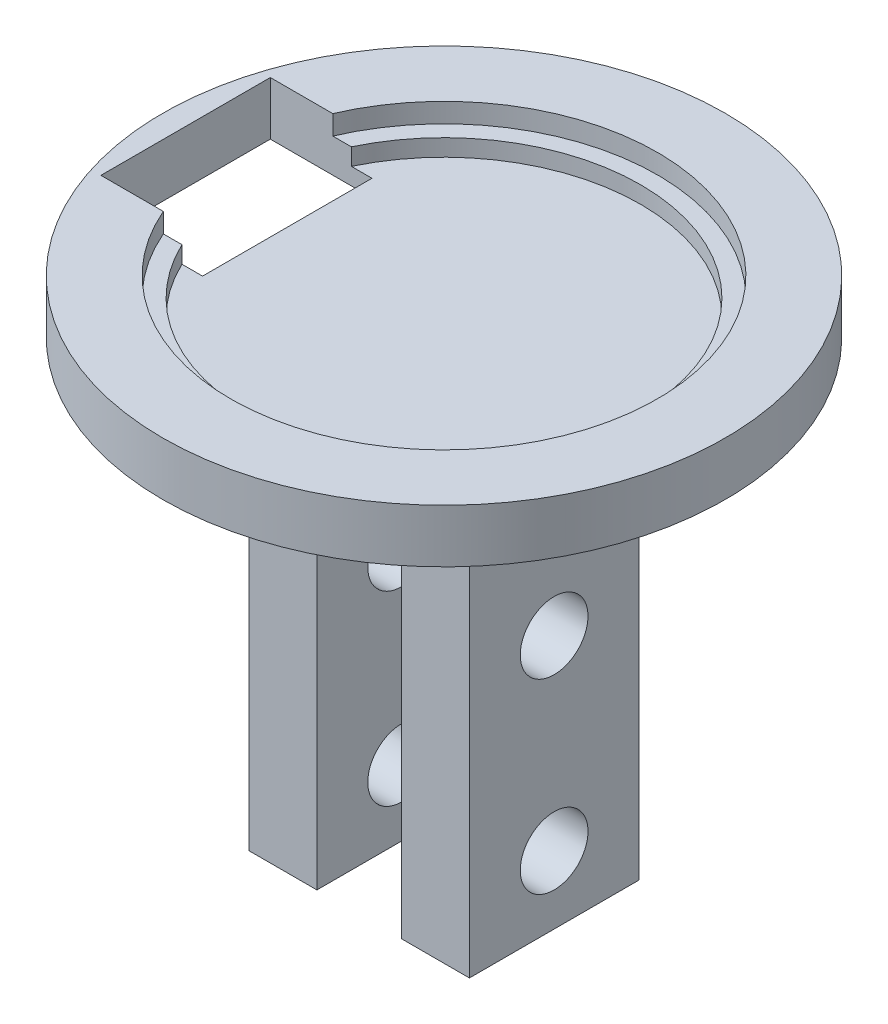
ISO-10303-21;
HEADER;
FILE_DESCRIPTION(('STEP AP214'),'2;1');
FILE_NAME('part.step','',(''),(''),'','','');
FILE_SCHEMA(('AUTOMOTIVE_DESIGN { 1 0 10303 214 1 1 1 1 }'));
ENDSEC;
DATA;
#1=APPLICATION_CONTEXT('core data for automotive mechanical design processes');
#2=APPLICATION_PROTOCOL_DEFINITION('international standard','automotive_design',2000,#1);
#3=PRODUCT_CONTEXT('',#1,'mechanical');
#4=PRODUCT('Part','Part','',(#3));
#5=PRODUCT_RELATED_PRODUCT_CATEGORY('part','',(#4));
#6=PRODUCT_DEFINITION_FORMATION('','',#4);
#7=PRODUCT_DEFINITION_CONTEXT('part definition',#1,'design');
#8=PRODUCT_DEFINITION('design','',#6,#7);
#9=PRODUCT_DEFINITION_SHAPE('','',#8);
#10=(LENGTH_UNIT() NAMED_UNIT(*) SI_UNIT(.MILLI.,.METRE.));
#11=(NAMED_UNIT(*) PLANE_ANGLE_UNIT() SI_UNIT($,.RADIAN.));
#12=(NAMED_UNIT(*) SI_UNIT($,.STERADIAN.) SOLID_ANGLE_UNIT());
#13=UNCERTAINTY_MEASURE_WITH_UNIT(LENGTH_MEASURE(1.E-05),#10,'distance_accuracy_value','');
#14=(GEOMETRIC_REPRESENTATION_CONTEXT(3) GLOBAL_UNCERTAINTY_ASSIGNED_CONTEXT((#13)) GLOBAL_UNIT_ASSIGNED_CONTEXT((#10,
#11,#12)) REPRESENTATION_CONTEXT('',''));
#15=CARTESIAN_POINT('',(0.,0.,0.));
#16=DIRECTION('',(0.,0.,1.));
#17=DIRECTION('',(1.,0.,0.));
#18=AXIS2_PLACEMENT_3D('',#15,#16,#17);
#19=CARTESIAN_POINT('',(-14.45,-6.492,0.));
#20=DIRECTION('',(0.,1.,0.));
#21=DIRECTION('',(0.,0.,1.));
#22=AXIS2_PLACEMENT_3D('',#19,#20,#21);
#23=PLANE('',#22);
#24=DIRECTION('',(0.,0.,-1.));
#25=VECTOR('',#24,1.);
#26=CARTESIAN_POINT('',(-7.1,-6.492,5.));
#27=LINE('',#26,#25);
#28=CARTESIAN_POINT('',(-7.1,-6.492,-7.75));
#29=VERTEX_POINT('',#28);
#30=CARTESIAN_POINT('',(-7.1,-6.492,-5.));
#31=VERTEX_POINT('',#30);
#32=EDGE_CURVE('E220',#29,#31,#27,.F.);
#33=ORIENTED_EDGE('',*,*,#32,.T.);
#34=DIRECTION('',(1.,0.,0.));
#35=VECTOR('',#34,1.);
#36=CARTESIAN_POINT('',(-13.1,-6.492,-5.));
#37=LINE('',#36,#35);
#38=CARTESIAN_POINT('',(-13.1,-6.492,-5.));
#39=VERTEX_POINT('',#38);
#40=EDGE_CURVE('E65',#39,#31,#37,.T.);
#41=ORIENTED_EDGE('',*,*,#40,.F.);
#42=DIRECTION('',(0.,0.,-1.));
#43=VECTOR('',#42,1.);
#44=CARTESIAN_POINT('',(-13.1,-6.492,-5.));
#45=LINE('',#44,#43);
#46=CARTESIAN_POINT('',(-13.1,-6.492,5.));
#47=VERTEX_POINT('',#46);
#48=EDGE_CURVE('E211',#47,#39,#45,.T.);
#49=ORIENTED_EDGE('',*,*,#48,.F.);
#50=DIRECTION('',(-1.,0.,0.));
#51=VECTOR('',#50,1.);
#52=CARTESIAN_POINT('',(-13.1,-6.492,5.));
#53=LINE('',#52,#51);
#54=CARTESIAN_POINT('',(-7.1,-6.492,5.));
#55=VERTEX_POINT('',#54);
#56=EDGE_CURVE('E188',#55,#47,#53,.T.);
#57=ORIENTED_EDGE('',*,*,#56,.F.);
#58=CARTESIAN_POINT('',(-7.1,-6.492,7.75));
#59=VERTEX_POINT('',#58);
#60=EDGE_CURVE('E208',#55,#59,#27,.F.);
#61=ORIENTED_EDGE('',*,*,#60,.T.);
#62=DIRECTION('',(-1.,0.,0.));
#63=VECTOR('',#62,1.);
#64=CARTESIAN_POINT('',(-0.350000000000001,-6.492,7.75));
#65=LINE('',#64,#63);
#66=CARTESIAN_POINT('',(1.9,-6.492,7.75));
#67=VERTEX_POINT('',#66);
#68=EDGE_CURVE('E225',#59,#67,#65,.F.);
#69=ORIENTED_EDGE('',*,*,#68,.T.);
#70=DIRECTION('',(-1.,0.,0.));
#71=VECTOR('',#70,1.);
#72=CARTESIAN_POINT('',(8.65,-6.492,7.75));
#73=LINE('',#72,#71);
#74=CARTESIAN_POINT('',(2.4,-6.492,7.75));
#75=VERTEX_POINT('',#74);
#76=EDGE_CURVE('E233',#67,#75,#73,.F.);
#77=ORIENTED_EDGE('',*,*,#76,.T.);
#78=DIRECTION('',(-1.,0.,0.));
#79=VECTOR('',#78,1.);
#80=CARTESIAN_POINT('',(8.65,-6.492,7.75));
#81=LINE('',#80,#79);
#82=CARTESIAN_POINT('',(11.4,-6.492,7.75));
#83=VERTEX_POINT('',#82);
#84=EDGE_CURVE('E249',#75,#83,#81,.F.);
#85=ORIENTED_EDGE('',*,*,#84,.T.);
#86=DIRECTION('',(0.,0.,1.));
#87=VECTOR('',#86,1.);
#88=CARTESIAN_POINT('',(11.4,-6.492,-5.));
#89=LINE('',#88,#87);
#90=CARTESIAN_POINT('',(11.4,-6.492,-7.75));
#91=VERTEX_POINT('',#90);
#92=EDGE_CURVE('E246',#83,#91,#89,.F.);
#93=ORIENTED_EDGE('',*,*,#92,.T.);
#94=DIRECTION('',(1.,0.,0.));
#95=VECTOR('',#94,1.);
#96=CARTESIAN_POINT('',(4.65,-6.492,-7.75));
#97=LINE('',#96,#95);
#98=CARTESIAN_POINT('',(2.4,-6.492,-7.75));
#99=VERTEX_POINT('',#98);
#100=EDGE_CURVE('E243',#91,#99,#97,.F.);
#101=ORIENTED_EDGE('',*,*,#100,.T.);
#102=DIRECTION('',(1.,0.,0.));
#103=VECTOR('',#102,1.);
#104=CARTESIAN_POINT('',(4.65,-6.492,-7.75));
#105=LINE('',#104,#103);
#106=CARTESIAN_POINT('',(1.9,-6.492,-7.75));
#107=VERTEX_POINT('',#106);
#108=EDGE_CURVE('E239',#99,#107,#105,.F.);
#109=ORIENTED_EDGE('',*,*,#108,.T.);
#110=DIRECTION('',(1.,0.,0.));
#111=VECTOR('',#110,1.);
#112=CARTESIAN_POINT('',(-4.35,-6.492,-7.75));
#113=LINE('',#112,#111);
#114=EDGE_CURVE('E236',#107,#29,#113,.F.);
#115=ORIENTED_EDGE('',*,*,#114,.T.);
#116=EDGE_LOOP('',(#33,#41,#49,#57,#61,#69,#77,#85,#93,#101,#109,#115));
#117=FACE_BOUND('',#116,.T.);
#118=CARTESIAN_POINT('',(2.15,-6.492,0.));
#119=DIRECTION('',(0.,-1.,0.));
#120=DIRECTION('',(0.,0.,-1.));
#121=AXIS2_PLACEMENT_3D('',#118,#119,#120);
#122=CIRCLE('',#121,16.6);
#123=CARTESIAN_POINT('',(2.15,-6.492,-16.6));
#124=VERTEX_POINT('',#123);
#125=EDGE_CURVE('E227',#124,#124,#122,.T.);
#126=ORIENTED_EDGE('',*,*,#125,.T.);
#127=EDGE_LOOP('',(#126));
#128=FACE_BOUND('',#127,.T.);
#129=ADVANCED_FACE('F41',(#117,#128),#23,.F.);
#130=CARTESIAN_POINT('',(2.15,-6.492,0.));
#131=DIRECTION('',(0.,-1.,0.));
#132=DIRECTION('',(0.,0.,-1.));
#133=AXIS2_PLACEMENT_3D('',#130,#131,#132);
#134=CYLINDRICAL_SURFACE('',#133,16.6);
#135=ORIENTED_EDGE('',*,*,#125,.F.);
#136=EDGE_LOOP('',(#135));
#137=FACE_BOUND('',#136,.T.);
#138=CARTESIAN_POINT('',(2.15,-3.342,0.));
#139=DIRECTION('',(0.,-1.,0.));
#140=DIRECTION('',(0.,0.,-1.));
#141=AXIS2_PLACEMENT_3D('',#138,#139,#140);
#142=CIRCLE('',#141,16.6);
#143=CARTESIAN_POINT('',(2.15,-3.342,-16.6));
#144=VERTEX_POINT('',#143);
#145=EDGE_CURVE('E458',#144,#144,#142,.T.);
#146=ORIENTED_EDGE('',*,*,#145,.T.);
#147=EDGE_LOOP('',(#146));
#148=FACE_BOUND('',#147,.T.);
#149=ADVANCED_FACE('F548',(#137,#148),#134,.T.);
#150=CARTESIAN_POINT('',(-9.45,-5.492,0.));
#151=DIRECTION('',(0.,-1.,0.));
#152=DIRECTION('',(0.,0.,-1.));
#153=AXIS2_PLACEMENT_3D('',#150,#151,#152);
#154=PLANE('',#153);
#155=CARTESIAN_POINT('',(2.15,-5.492,0.));
#156=DIRECTION('',(0.,-1.,0.));
#157=DIRECTION('',(0.,0.,-1.));
#158=AXIS2_PLACEMENT_3D('',#155,#156,#157);
#159=CIRCLE('',#158,11.6);
#160=CARTESIAN_POINT('',(-8.31709128650362,-5.492,-5.));
#161=VERTEX_POINT('',#160);
#162=CARTESIAN_POINT('',(-8.31709128650362,-5.492,5.));
#163=VERTEX_POINT('',#162);
#164=EDGE_CURVE('E473',#161,#163,#159,.T.);
#165=ORIENTED_EDGE('',*,*,#164,.F.);
#166=DIRECTION('',(1.,0.,0.));
#167=VECTOR('',#166,1.);
#168=CARTESIAN_POINT('',(-9.45,-5.492,-5.));
#169=LINE('',#168,#167);
#170=CARTESIAN_POINT('',(-7.1,-5.492,-5.));
#171=VERTEX_POINT('',#170);
#172=EDGE_CURVE('E280',#161,#171,#169,.T.);
#173=ORIENTED_EDGE('',*,*,#172,.T.);
#174=DIRECTION('',(0.,0.,1.));
#175=VECTOR('',#174,1.);
#176=CARTESIAN_POINT('',(-7.1,-5.492,0.));
#177=LINE('',#176,#175);
#178=CARTESIAN_POINT('',(-7.1,-5.492,5.));
#179=VERTEX_POINT('',#178);
#180=EDGE_CURVE('E339',#171,#179,#177,.T.);
#181=ORIENTED_EDGE('',*,*,#180,.T.);
#182=DIRECTION('',(-1.,0.,0.));
#183=VECTOR('',#182,1.);
#184=CARTESIAN_POINT('',(-9.45,-5.492,5.));
#185=LINE('',#184,#183);
#186=EDGE_CURVE('E191',#179,#163,#185,.T.);
#187=ORIENTED_EDGE('',*,*,#186,.T.);
#188=EDGE_LOOP('',(#165,#173,#181,#187));
#189=FACE_BOUND('',#188,.T.);
#190=ADVANCED_FACE('F553',(#189),#154,.F.);
#191=CARTESIAN_POINT('',(2.15,-6.492,0.));
#192=DIRECTION('',(0.,-1.,0.));
#193=DIRECTION('',(0.,0.,-1.));
#194=AXIS2_PLACEMENT_3D('',#191,#192,#193);
#195=CYLINDRICAL_SURFACE('',#194,11.6);
#196=CARTESIAN_POINT('',(2.15,-4.492,0.));
#197=DIRECTION('',(0.,-1.,0.));
#198=DIRECTION('',(0.,0.,-1.));
#199=AXIS2_PLACEMENT_3D('',#196,#197,#198);
#200=CIRCLE('',#199,11.6);
#201=CARTESIAN_POINT('',(-8.31709128650362,-4.492,-5.));
#202=VERTEX_POINT('',#201);
#203=CARTESIAN_POINT('',(-8.31709128650362,-4.492,5.));
#204=VERTEX_POINT('',#203);
#205=EDGE_CURVE('E469',#202,#204,#200,.T.);
#206=ORIENTED_EDGE('',*,*,#205,.F.);
#207=DIRECTION('',(0.,-1.,0.));
#208=VECTOR('',#207,1.);
#209=CARTESIAN_POINT('',(-8.31709128650362,-6.492,-5.));
#210=LINE('',#209,#208);
#211=EDGE_CURVE('E368',#202,#161,#210,.T.);
#212=ORIENTED_EDGE('',*,*,#211,.T.);
#213=ORIENTED_EDGE('',*,*,#164,.T.);
#214=DIRECTION('',(0.,-1.,0.));
#215=VECTOR('',#214,1.);
#216=CARTESIAN_POINT('',(-8.31709128650362,-6.492,5.));
#217=LINE('',#216,#215);
#218=EDGE_CURVE('E354',#163,#204,#217,.F.);
#219=ORIENTED_EDGE('',*,*,#218,.T.);
#220=EDGE_LOOP('',(#206,#212,#213,#219));
#221=FACE_BOUND('',#220,.T.);
#222=ADVANCED_FACE('F641',(#221),#195,.F.);
#223=CARTESIAN_POINT('',(-10.45,-4.492,0.));
#224=DIRECTION('',(0.,-1.,0.));
#225=DIRECTION('',(0.,0.,-1.));
#226=AXIS2_PLACEMENT_3D('',#223,#224,#225);
#227=PLANE('',#226);
#228=CARTESIAN_POINT('',(2.15,-4.492,0.));
#229=DIRECTION('',(0.,-1.,0.));
#230=DIRECTION('',(0.,0.,-1.));
#231=AXIS2_PLACEMENT_3D('',#228,#229,#230);
#232=CIRCLE('',#231,12.6);
#233=CARTESIAN_POINT('',(-9.41546583584077,-4.492,-5.));
#234=VERTEX_POINT('',#233);
#235=CARTESIAN_POINT('',(-9.41546583584077,-4.492,5.));
#236=VERTEX_POINT('',#235);
#237=EDGE_CURVE('E465',#234,#236,#232,.T.);
#238=ORIENTED_EDGE('',*,*,#237,.F.);
#239=DIRECTION('',(1.,0.,0.));
#240=VECTOR('',#239,1.);
#241=CARTESIAN_POINT('',(-10.45,-4.492,-5.));
#242=LINE('',#241,#240);
#243=EDGE_CURVE('E364',#234,#202,#242,.T.);
#244=ORIENTED_EDGE('',*,*,#243,.T.);
#245=ORIENTED_EDGE('',*,*,#205,.T.);
#246=DIRECTION('',(-1.,0.,0.));
#247=VECTOR('',#246,1.);
#248=CARTESIAN_POINT('',(-10.45,-4.492,5.));
#249=LINE('',#248,#247);
#250=EDGE_CURVE('E350',#204,#236,#249,.T.);
#251=ORIENTED_EDGE('',*,*,#250,.T.);
#252=EDGE_LOOP('',(#238,#244,#245,#251));
#253=FACE_BOUND('',#252,.T.);
#254=ADVANCED_FACE('F638',(#253),#227,.F.);
#255=CARTESIAN_POINT('',(2.15,-6.492,0.));
#256=DIRECTION('',(0.,-1.,0.));
#257=DIRECTION('',(0.,0.,-1.));
#258=AXIS2_PLACEMENT_3D('',#255,#256,#257);
#259=CYLINDRICAL_SURFACE('',#258,12.6);
#260=CARTESIAN_POINT('',(2.15,-3.342,0.));
#261=DIRECTION('',(0.,-1.,0.));
#262=DIRECTION('',(0.,0.,-1.));
#263=AXIS2_PLACEMENT_3D('',#260,#261,#262);
#264=CIRCLE('',#263,12.6);
#265=CARTESIAN_POINT('',(-9.41546583584077,-3.342,-5.));
#266=VERTEX_POINT('',#265);
#267=CARTESIAN_POINT('',(-9.41546583584077,-3.342,5.));
#268=VERTEX_POINT('',#267);
#269=EDGE_CURVE('E462',#266,#268,#264,.T.);
#270=ORIENTED_EDGE('',*,*,#269,.F.);
#271=DIRECTION('',(0.,-1.,0.));
#272=VECTOR('',#271,1.);
#273=CARTESIAN_POINT('',(-9.41546583584077,-6.492,-5.));
#274=LINE('',#273,#272);
#275=EDGE_CURVE('E360',#266,#234,#274,.T.);
#276=ORIENTED_EDGE('',*,*,#275,.T.);
#277=ORIENTED_EDGE('',*,*,#237,.T.);
#278=DIRECTION('',(0.,-1.,0.));
#279=VECTOR('',#278,1.);
#280=CARTESIAN_POINT('',(-9.41546583584077,-6.492,5.));
#281=LINE('',#280,#279);
#282=EDGE_CURVE('E346',#236,#268,#281,.F.);
#283=ORIENTED_EDGE('',*,*,#282,.T.);
#284=EDGE_LOOP('',(#270,#276,#277,#283));
#285=FACE_BOUND('',#284,.T.);
#286=ADVANCED_FACE('F634',(#285),#259,.F.);
#287=CARTESIAN_POINT('',(-14.45,-3.342,0.));
#288=DIRECTION('',(0.,-1.,0.));
#289=DIRECTION('',(0.,0.,-1.));
#290=AXIS2_PLACEMENT_3D('',#287,#288,#289);
#291=PLANE('',#290);
#292=ORIENTED_EDGE('',*,*,#145,.F.);
#293=EDGE_LOOP('',(#292));
#294=FACE_BOUND('',#293,.T.);
#295=DIRECTION('',(0.,0.,-1.));
#296=VECTOR('',#295,1.);
#297=CARTESIAN_POINT('',(-13.1,-3.342,0.));
#298=LINE('',#297,#296);
#299=CARTESIAN_POINT('',(-13.1,-3.342,5.));
#300=VERTEX_POINT('',#299);
#301=CARTESIAN_POINT('',(-13.1,-3.342,-5.));
#302=VERTEX_POINT('',#301);
#303=EDGE_CURVE('E50',#300,#302,#298,.T.);
#304=ORIENTED_EDGE('',*,*,#303,.T.);
#305=DIRECTION('',(1.,0.,0.));
#306=VECTOR('',#305,1.);
#307=CARTESIAN_POINT('',(-14.45,-3.342,-5.));
#308=LINE('',#307,#306);
#309=EDGE_CURVE('E11',#302,#266,#308,.T.);
#310=ORIENTED_EDGE('',*,*,#309,.T.);
#311=ORIENTED_EDGE('',*,*,#269,.T.);
#312=DIRECTION('',(-1.,0.,0.));
#313=VECTOR('',#312,1.);
#314=CARTESIAN_POINT('',(-14.45,-3.342,5.));
#315=LINE('',#314,#313);
#316=EDGE_CURVE('E274',#268,#300,#315,.T.);
#317=ORIENTED_EDGE('',*,*,#316,.T.);
#318=EDGE_LOOP('',(#304,#310,#311,#317));
#319=FACE_BOUND('',#318,.T.);
#320=ADVANCED_FACE('F328',(#294,#319),#291,.F.);
#321=CARTESIAN_POINT('',(-4.35,-33.492,5.));
#322=DIRECTION('',(1.,0.,0.));
#323=DIRECTION('',(0.,0.,-1.));
#324=AXIS2_PLACEMENT_3D('',#321,#322,#323);
#325=PLANE('',#324);
#326=CARTESIAN_POINT('',(-4.35,-29.492,0.));
#327=DIRECTION('',(-1.,0.,0.));
#328=DIRECTION('',(0.,0.,1.));
#329=AXIS2_PLACEMENT_3D('',#326,#327,#328);
#330=CIRCLE('',#329,2.);
#331=CARTESIAN_POINT('',(-4.35,-29.492,2.));
#332=VERTEX_POINT('',#331);
#333=EDGE_CURVE('E375',#332,#332,#330,.T.);
#334=ORIENTED_EDGE('',*,*,#333,.F.);
#335=EDGE_LOOP('',(#334));
#336=FACE_BOUND('',#335,.T.);
#337=CARTESIAN_POINT('',(-4.35,-18.492,0.));
#338=DIRECTION('',(-1.,0.,0.));
#339=DIRECTION('',(0.,0.,1.));
#340=AXIS2_PLACEMENT_3D('',#337,#338,#339);
#341=CIRCLE('',#340,2.);
#342=CARTESIAN_POINT('',(-4.35,-18.492,2.));
#343=VERTEX_POINT('',#342);
#344=EDGE_CURVE('E322',#343,#343,#341,.T.);
#345=ORIENTED_EDGE('',*,*,#344,.F.);
#346=EDGE_LOOP('',(#345));
#347=FACE_BOUND('',#346,.T.);
#348=DIRECTION('',(0.,1.,0.));
#349=VECTOR('',#348,1.);
#350=CARTESIAN_POINT('',(-4.35,-33.492,5.));
#351=LINE('',#350,#349);
#352=CARTESIAN_POINT('',(-4.35,-33.492,5.));
#353=VERTEX_POINT('',#352);
#354=CARTESIAN_POINT('',(-4.35,-9.242,5.));
#355=VERTEX_POINT('',#354);
#356=EDGE_CURVE('E442',#353,#355,#351,.T.);
#357=ORIENTED_EDGE('',*,*,#356,.T.);
#358=DIRECTION('',(0.,0.,-1.));
#359=VECTOR('',#358,1.);
#360=CARTESIAN_POINT('',(-4.35,-9.242,-5.));
#361=LINE('',#360,#359);
#362=CARTESIAN_POINT('',(-4.35,-9.242,-5.));
#363=VERTEX_POINT('',#362);
#364=EDGE_CURVE('E271',#355,#363,#361,.T.);
#365=ORIENTED_EDGE('',*,*,#364,.T.);
#366=DIRECTION('',(0.,1.,0.));
#367=VECTOR('',#366,1.);
#368=CARTESIAN_POINT('',(-4.35,-33.492,-5.));
#369=LINE('',#368,#367);
#370=CARTESIAN_POINT('',(-4.35,-33.492,-5.));
#371=VERTEX_POINT('',#370);
#372=EDGE_CURVE('E454',#371,#363,#369,.T.);
#373=ORIENTED_EDGE('',*,*,#372,.F.);
#374=DIRECTION('',(0.,0.,-1.));
#375=VECTOR('',#374,1.);
#376=CARTESIAN_POINT('',(-4.35,-33.492,5.));
#377=LINE('',#376,#375);
#378=EDGE_CURVE('E429',#353,#371,#377,.T.);
#379=ORIENTED_EDGE('',*,*,#378,.F.);
#380=EDGE_LOOP('',(#357,#365,#373,#379));
#381=FACE_BOUND('',#380,.T.);
#382=ADVANCED_FACE('F614',(#336,#347,#381),#325,.F.);
#383=CARTESIAN_POINT('',(-4.35,-33.492,-5.));
#384=DIRECTION('',(0.,0.,1.));
#385=DIRECTION('',(1.,0.,0.));
#386=AXIS2_PLACEMENT_3D('',#383,#384,#385);
#387=PLANE('',#386);
#388=ORIENTED_EDGE('',*,*,#372,.T.);
#389=DIRECTION('',(1.,0.,0.));
#390=VECTOR('',#389,1.);
#391=CARTESIAN_POINT('',(-0.35,-9.242,-5.));
#392=LINE('',#391,#390);
#393=CARTESIAN_POINT('',(-0.35,-9.242,-5.));
#394=VERTEX_POINT('',#393);
#395=EDGE_CURVE('E252',#363,#394,#392,.T.);
#396=ORIENTED_EDGE('',*,*,#395,.T.);
#397=DIRECTION('',(0.,1.,0.));
#398=VECTOR('',#397,1.);
#399=CARTESIAN_POINT('',(-0.35,-33.492,-5.));
#400=LINE('',#399,#398);
#401=CARTESIAN_POINT('',(-0.35,-33.492,-5.));
#402=VERTEX_POINT('',#401);
#403=EDGE_CURVE('E450',#402,#394,#400,.T.);
#404=ORIENTED_EDGE('',*,*,#403,.F.);
#405=DIRECTION('',(1.,0.,0.));
#406=VECTOR('',#405,1.);
#407=CARTESIAN_POINT('',(-4.35,-33.492,-5.));
#408=LINE('',#407,#406);
#409=EDGE_CURVE('E433',#371,#402,#408,.T.);
#410=ORIENTED_EDGE('',*,*,#409,.F.);
#411=EDGE_LOOP('',(#388,#396,#404,#410));
#412=FACE_BOUND('',#411,.T.);
#413=ADVANCED_FACE('F603',(#412),#387,.F.);
#414=CARTESIAN_POINT('',(-0.350000000000002,-33.492,5.));
#415=DIRECTION('',(-1.,0.,0.));
#416=DIRECTION('',(0.,0.,1.));
#417=AXIS2_PLACEMENT_3D('',#414,#415,#416);
#418=PLANE('',#417);
#419=CARTESIAN_POINT('',(-0.350000000000003,-29.492,0.));
#420=DIRECTION('',(-1.,0.,0.));
#421=DIRECTION('',(0.,0.,1.));
#422=AXIS2_PLACEMENT_3D('',#419,#420,#421);
#423=CIRCLE('',#422,2.);
#424=CARTESIAN_POINT('',(-0.350000000000003,-29.492,2.));
#425=VERTEX_POINT('',#424);
#426=EDGE_CURVE('E396',#425,#425,#423,.T.);
#427=ORIENTED_EDGE('',*,*,#426,.T.);
#428=EDGE_LOOP('',(#427));
#429=FACE_BOUND('',#428,.T.);
#430=CARTESIAN_POINT('',(-0.350000000000003,-18.492,0.));
#431=DIRECTION('',(-1.,0.,0.));
#432=DIRECTION('',(0.,0.,1.));
#433=AXIS2_PLACEMENT_3D('',#430,#431,#432);
#434=CIRCLE('',#433,2.);
#435=CARTESIAN_POINT('',(-0.350000000000003,-18.492,2.));
#436=VERTEX_POINT('',#435);
#437=EDGE_CURVE('E387',#436,#436,#434,.T.);
#438=ORIENTED_EDGE('',*,*,#437,.T.);
#439=EDGE_LOOP('',(#438));
#440=FACE_BOUND('',#439,.T.);
#441=ORIENTED_EDGE('',*,*,#403,.T.);
#442=DIRECTION('',(0.,0.,1.));
#443=VECTOR('',#442,1.);
#444=CARTESIAN_POINT('',(-0.350000000000002,-9.242,5.));
#445=LINE('',#444,#443);
#446=CARTESIAN_POINT('',(-0.350000000000002,-9.242,5.));
#447=VERTEX_POINT('',#446);
#448=EDGE_CURVE('E268',#394,#447,#445,.T.);
#449=ORIENTED_EDGE('',*,*,#448,.T.);
#450=DIRECTION('',(0.,1.,0.));
#451=VECTOR('',#450,1.);
#452=CARTESIAN_POINT('',(-0.350000000000002,-33.492,5.));
#453=LINE('',#452,#451);
#454=CARTESIAN_POINT('',(-0.350000000000002,-33.492,5.));
#455=VERTEX_POINT('',#454);
#456=EDGE_CURVE('E446',#455,#447,#453,.T.);
#457=ORIENTED_EDGE('',*,*,#456,.F.);
#458=DIRECTION('',(0.,0.,1.));
#459=VECTOR('',#458,1.);
#460=CARTESIAN_POINT('',(-0.350000000000002,-33.492,5.));
#461=LINE('',#460,#459);
#462=EDGE_CURVE('E436',#402,#455,#461,.T.);
#463=ORIENTED_EDGE('',*,*,#462,.F.);
#464=EDGE_LOOP('',(#441,#449,#457,#463));
#465=FACE_BOUND('',#464,.T.);
#466=ADVANCED_FACE('F607',(#429,#440,#465),#418,.F.);
#467=CARTESIAN_POINT('',(-4.35,-33.492,5.));
#468=DIRECTION('',(0.,0.,-1.));
#469=DIRECTION('',(-1.,0.,0.));
#470=AXIS2_PLACEMENT_3D('',#467,#468,#469);
#471=PLANE('',#470);
#472=ORIENTED_EDGE('',*,*,#456,.T.);
#473=DIRECTION('',(-1.,0.,0.));
#474=VECTOR('',#473,1.);
#475=CARTESIAN_POINT('',(-4.35,-9.242,5.));
#476=LINE('',#475,#474);
#477=EDGE_CURVE('E259',#447,#355,#476,.T.);
#478=ORIENTED_EDGE('',*,*,#477,.T.);
#479=ORIENTED_EDGE('',*,*,#356,.F.);
#480=DIRECTION('',(-1.,0.,0.));
#481=VECTOR('',#480,1.);
#482=CARTESIAN_POINT('',(-4.35,-33.492,5.));
#483=LINE('',#482,#481);
#484=EDGE_CURVE('E439',#455,#353,#483,.T.);
#485=ORIENTED_EDGE('',*,*,#484,.F.);
#486=EDGE_LOOP('',(#472,#478,#479,#485));
#487=FACE_BOUND('',#486,.T.);
#488=ADVANCED_FACE('F616',(#487),#471,.F.);
#489=CARTESIAN_POINT('',(0.,-33.492,0.));
#490=DIRECTION('',(0.,-1.,0.));
#491=DIRECTION('',(0.,0.,-1.));
#492=AXIS2_PLACEMENT_3D('',#489,#490,#491);
#493=PLANE('',#492);
#494=ORIENTED_EDGE('',*,*,#378,.T.);
#495=ORIENTED_EDGE('',*,*,#409,.T.);
#496=ORIENTED_EDGE('',*,*,#462,.T.);
#497=ORIENTED_EDGE('',*,*,#484,.T.);
#498=EDGE_LOOP('',(#494,#495,#496,#497));
#499=FACE_BOUND('',#498,.T.);
#500=ADVANCED_FACE('F502',(#499),#493,.T.);
#501=CARTESIAN_POINT('',(8.65,-33.492,5.));
#502=DIRECTION('',(-1.,0.,0.));
#503=DIRECTION('',(0.,0.,1.));
#504=AXIS2_PLACEMENT_3D('',#501,#502,#503);
#505=PLANE('',#504);
#506=CARTESIAN_POINT('',(8.65,-29.492,0.));
#507=DIRECTION('',(-1.,0.,0.));
#508=DIRECTION('',(0.,0.,1.));
#509=AXIS2_PLACEMENT_3D('',#506,#507,#508);
#510=CIRCLE('',#509,2.);
#511=CARTESIAN_POINT('',(8.65,-29.492,2.));
#512=VERTEX_POINT('',#511);
#513=EDGE_CURVE('E392',#512,#512,#510,.T.);
#514=ORIENTED_EDGE('',*,*,#513,.T.);
#515=EDGE_LOOP('',(#514));
#516=FACE_BOUND('',#515,.T.);
#517=CARTESIAN_POINT('',(8.65,-18.492,0.));
#518=DIRECTION('',(-1.,0.,0.));
#519=DIRECTION('',(0.,0.,1.));
#520=AXIS2_PLACEMENT_3D('',#517,#518,#519);
#521=CIRCLE('',#520,2.);
#522=CARTESIAN_POINT('',(8.65,-18.492,2.));
#523=VERTEX_POINT('',#522);
#524=EDGE_CURVE('E383',#523,#523,#521,.T.);
#525=ORIENTED_EDGE('',*,*,#524,.T.);
#526=EDGE_LOOP('',(#525));
#527=FACE_BOUND('',#526,.T.);
#528=DIRECTION('',(0.,1.,0.));
#529=VECTOR('',#528,1.);
#530=CARTESIAN_POINT('',(8.65,-33.492,-5.));
#531=LINE('',#530,#529);
#532=CARTESIAN_POINT('',(8.65,-33.492,-5.));
#533=VERTEX_POINT('',#532);
#534=CARTESIAN_POINT('',(8.65,-9.242,-5.));
#535=VERTEX_POINT('',#534);
#536=EDGE_CURVE('E413',#533,#535,#531,.T.);
#537=ORIENTED_EDGE('',*,*,#536,.T.);
#538=DIRECTION('',(0.,0.,1.));
#539=VECTOR('',#538,1.);
#540=CARTESIAN_POINT('',(8.65,-9.242,5.));
#541=LINE('',#540,#539);
#542=CARTESIAN_POINT('',(8.65,-9.242,5.));
#543=VERTEX_POINT('',#542);
#544=EDGE_CURVE('E262',#535,#543,#541,.T.);
#545=ORIENTED_EDGE('',*,*,#544,.T.);
#546=DIRECTION('',(0.,1.,0.));
#547=VECTOR('',#546,1.);
#548=CARTESIAN_POINT('',(8.65,-33.492,5.));
#549=LINE('',#548,#547);
#550=CARTESIAN_POINT('',(8.65,-33.492,5.));
#551=VERTEX_POINT('',#550);
#552=EDGE_CURVE('E425',#551,#543,#549,.T.);
#553=ORIENTED_EDGE('',*,*,#552,.F.);
#554=DIRECTION('',(0.,0.,1.));
#555=VECTOR('',#554,1.);
#556=CARTESIAN_POINT('',(8.65,-33.492,5.));
#557=LINE('',#556,#555);
#558=EDGE_CURVE('E400',#533,#551,#557,.T.);
#559=ORIENTED_EDGE('',*,*,#558,.F.);
#560=EDGE_LOOP('',(#537,#545,#553,#559));
#561=FACE_BOUND('',#560,.T.);
#562=ADVANCED_FACE('F498',(#516,#527,#561),#505,.F.);
#563=CARTESIAN_POINT('',(8.65,-33.492,5.));
#564=DIRECTION('',(0.,0.,-1.));
#565=DIRECTION('',(-1.,0.,0.));
#566=AXIS2_PLACEMENT_3D('',#563,#564,#565);
#567=PLANE('',#566);
#568=ORIENTED_EDGE('',*,*,#552,.T.);
#569=DIRECTION('',(-1.,0.,0.));
#570=VECTOR('',#569,1.);
#571=CARTESIAN_POINT('',(4.65,-9.242,5.));
#572=LINE('',#571,#570);
#573=CARTESIAN_POINT('',(4.65,-9.242,5.));
#574=VERTEX_POINT('',#573);
#575=EDGE_CURVE('E256',#543,#574,#572,.T.);
#576=ORIENTED_EDGE('',*,*,#575,.T.);
#577=DIRECTION('',(0.,1.,0.));
#578=VECTOR('',#577,1.);
#579=CARTESIAN_POINT('',(4.65,-33.492,5.));
#580=LINE('',#579,#578);
#581=CARTESIAN_POINT('',(4.65,-33.492,5.));
#582=VERTEX_POINT('',#581);
#583=EDGE_CURVE('E421',#582,#574,#580,.T.);
#584=ORIENTED_EDGE('',*,*,#583,.F.);
#585=DIRECTION('',(-1.,0.,0.));
#586=VECTOR('',#585,1.);
#587=CARTESIAN_POINT('',(8.65,-33.492,5.));
#588=LINE('',#587,#586);
#589=EDGE_CURVE('E404',#551,#582,#588,.T.);
#590=ORIENTED_EDGE('',*,*,#589,.F.);
#591=EDGE_LOOP('',(#568,#576,#584,#590));
#592=FACE_BOUND('',#591,.T.);
#593=ADVANCED_FACE('F501',(#592),#567,.F.);
#594=CARTESIAN_POINT('',(4.65,-33.492,5.));
#595=DIRECTION('',(1.,0.,0.));
#596=DIRECTION('',(0.,0.,-1.));
#597=AXIS2_PLACEMENT_3D('',#594,#595,#596);
#598=PLANE('',#597);
#599=CARTESIAN_POINT('',(4.65,-29.492,0.));
#600=DIRECTION('',(1.,0.,0.));
#601=DIRECTION('',(0.,0.,-1.));
#602=AXIS2_PLACEMENT_3D('',#599,#600,#601);
#603=CIRCLE('',#602,2.);
#604=CARTESIAN_POINT('',(4.65,-29.492,-2.));
#605=VERTEX_POINT('',#604);
#606=EDGE_CURVE('E391',#605,#605,#603,.T.);
#607=ORIENTED_EDGE('',*,*,#606,.T.);
#608=EDGE_LOOP('',(#607));
#609=FACE_BOUND('',#608,.T.);
#610=CARTESIAN_POINT('',(4.65,-18.492,0.));
#611=DIRECTION('',(1.,0.,0.));
#612=DIRECTION('',(0.,0.,-1.));
#613=AXIS2_PLACEMENT_3D('',#610,#611,#612);
#614=CIRCLE('',#613,2.);
#615=CARTESIAN_POINT('',(4.65,-18.492,-2.));
#616=VERTEX_POINT('',#615);
#617=EDGE_CURVE('E379',#616,#616,#614,.T.);
#618=ORIENTED_EDGE('',*,*,#617,.T.);
#619=EDGE_LOOP('',(#618));
#620=FACE_BOUND('',#619,.T.);
#621=ORIENTED_EDGE('',*,*,#583,.T.);
#622=DIRECTION('',(0.,0.,-1.));
#623=VECTOR('',#622,1.);
#624=CARTESIAN_POINT('',(4.65,-9.242,-5.));
#625=LINE('',#624,#623);
#626=CARTESIAN_POINT('',(4.65,-9.242,-5.));
#627=VERTEX_POINT('',#626);
#628=EDGE_CURVE('E265',#574,#627,#625,.T.);
#629=ORIENTED_EDGE('',*,*,#628,.T.);
#630=DIRECTION('',(0.,1.,0.));
#631=VECTOR('',#630,1.);
#632=CARTESIAN_POINT('',(4.65,-33.492,-5.));
#633=LINE('',#632,#631);
#634=CARTESIAN_POINT('',(4.65,-33.492,-5.));
#635=VERTEX_POINT('',#634);
#636=EDGE_CURVE('E417',#635,#627,#633,.T.);
#637=ORIENTED_EDGE('',*,*,#636,.F.);
#638=DIRECTION('',(0.,0.,-1.));
#639=VECTOR('',#638,1.);
#640=CARTESIAN_POINT('',(4.65,-33.492,5.));
#641=LINE('',#640,#639);
#642=EDGE_CURVE('E407',#582,#635,#641,.T.);
#643=ORIENTED_EDGE('',*,*,#642,.F.);
#644=EDGE_LOOP('',(#621,#629,#637,#643));
#645=FACE_BOUND('',#644,.T.);
#646=ADVANCED_FACE('F486',(#609,#620,#645),#598,.F.);
#647=CARTESIAN_POINT('',(8.65,-33.492,-5.));
#648=DIRECTION('',(0.,0.,1.));
#649=DIRECTION('',(1.,0.,0.));
#650=AXIS2_PLACEMENT_3D('',#647,#648,#649);
#651=PLANE('',#650);
#652=ORIENTED_EDGE('',*,*,#636,.T.);
#653=DIRECTION('',(1.,0.,0.));
#654=VECTOR('',#653,1.);
#655=CARTESIAN_POINT('',(8.65,-9.242,-5.));
#656=LINE('',#655,#654);
#657=EDGE_CURVE('E221',#627,#535,#656,.T.);
#658=ORIENTED_EDGE('',*,*,#657,.T.);
#659=ORIENTED_EDGE('',*,*,#536,.F.);
#660=DIRECTION('',(1.,0.,0.));
#661=VECTOR('',#660,1.);
#662=CARTESIAN_POINT('',(8.65,-33.492,-5.));
#663=LINE('',#662,#661);
#664=EDGE_CURVE('E410',#635,#533,#663,.T.);
#665=ORIENTED_EDGE('',*,*,#664,.F.);
#666=EDGE_LOOP('',(#652,#658,#659,#665));
#667=FACE_BOUND('',#666,.T.);
#668=ADVANCED_FACE('F512',(#667),#651,.F.);
#669=CARTESIAN_POINT('',(0.,-33.492,0.));
#670=DIRECTION('',(0.,1.,0.));
#671=DIRECTION('',(0.,0.,1.));
#672=AXIS2_PLACEMENT_3D('',#669,#670,#671);
#673=PLANE('',#672);
#674=ORIENTED_EDGE('',*,*,#558,.T.);
#675=ORIENTED_EDGE('',*,*,#589,.T.);
#676=ORIENTED_EDGE('',*,*,#642,.T.);
#677=ORIENTED_EDGE('',*,*,#664,.T.);
#678=EDGE_LOOP('',(#674,#675,#676,#677));
#679=FACE_BOUND('',#678,.T.);
#680=ADVANCED_FACE('F537',(#679),#673,.F.);
#681=CARTESIAN_POINT('',(17.95,-18.492,0.));
#682=DIRECTION('',(-1.,0.,0.));
#683=DIRECTION('',(0.,0.,1.));
#684=AXIS2_PLACEMENT_3D('',#681,#682,#683);
#685=CYLINDRICAL_SURFACE('',#684,2.);
#686=ORIENTED_EDGE('',*,*,#617,.F.);
#687=EDGE_LOOP('',(#686));
#688=FACE_BOUND('',#687,.T.);
#689=ORIENTED_EDGE('',*,*,#524,.F.);
#690=EDGE_LOOP('',(#689));
#691=FACE_BOUND('',#690,.T.);
#692=ADVANCED_FACE('F493',(#688,#691),#685,.F.);
#693=CARTESIAN_POINT('',(17.95,-29.492,0.));
#694=DIRECTION('',(-1.,0.,0.));
#695=DIRECTION('',(0.,0.,1.));
#696=AXIS2_PLACEMENT_3D('',#693,#694,#695);
#697=CYLINDRICAL_SURFACE('',#696,2.);
#698=ORIENTED_EDGE('',*,*,#606,.F.);
#699=EDGE_LOOP('',(#698));
#700=FACE_BOUND('',#699,.T.);
#701=ORIENTED_EDGE('',*,*,#513,.F.);
#702=EDGE_LOOP('',(#701));
#703=FACE_BOUND('',#702,.T.);
#704=ADVANCED_FACE('F489',(#700,#703),#697,.F.);
#705=ORIENTED_EDGE('',*,*,#344,.T.);
#706=EDGE_LOOP('',(#705));
#707=FACE_BOUND('',#706,.T.);
#708=ORIENTED_EDGE('',*,*,#437,.F.);
#709=EDGE_LOOP('',(#708));
#710=FACE_BOUND('',#709,.T.);
#711=ADVANCED_FACE('F492',(#707,#710),#685,.F.);
#712=ORIENTED_EDGE('',*,*,#333,.T.);
#713=EDGE_LOOP('',(#712));
#714=FACE_BOUND('',#713,.T.);
#715=ORIENTED_EDGE('',*,*,#426,.F.);
#716=EDGE_LOOP('',(#715));
#717=FACE_BOUND('',#716,.T.);
#718=ADVANCED_FACE('F495',(#714,#717),#697,.F.);
#719=CARTESIAN_POINT('',(8.65,-9.242,7.75));
#720=DIRECTION('',(1.,0.,0.));
#721=DIRECTION('',(0.,0.,-1.));
#722=AXIS2_PLACEMENT_3D('',#719,#720,#721);
#723=CYLINDRICAL_SURFACE('',#722,2.75);
#724=CARTESIAN_POINT('',(2.4,-9.242,7.75));
#725=DIRECTION('',(0.707106781186548,0.,-0.707106781186547));
#726=DIRECTION('',(-0.707106781186547,0.,-0.707106781186548));
#727=AXIS2_PLACEMENT_3D('',#724,#725,#726);
#728=ELLIPSE('',#727,3.88908729652601,2.75);
#729=CARTESIAN_POINT('',(2.15,-6.50338721247417,7.5));
#730=VERTEX_POINT('',#729);
#731=EDGE_CURVE('E314',#75,#730,#728,.F.);
#732=ORIENTED_EDGE('',*,*,#731,.F.);
#733=ORIENTED_EDGE('',*,*,#76,.F.);
#734=CARTESIAN_POINT('',(1.9,-9.242,7.75));
#735=DIRECTION('',(0.707106781186547,0.,0.707106781186548));
#736=DIRECTION('',(-0.707106781186548,0.,0.707106781186547));
#737=AXIS2_PLACEMENT_3D('',#734,#735,#736);
#738=ELLIPSE('',#737,3.88908729652601,2.75);
#739=EDGE_CURVE('E318',#730,#67,#738,.T.);
#740=ORIENTED_EDGE('',*,*,#739,.F.);
#741=EDGE_LOOP('',(#732,#733,#740));
#742=FACE_BOUND('',#741,.T.);
#743=ADVANCED_FACE('F43',(#742),#723,.F.);
#744=CARTESIAN_POINT('',(-4.35,-9.242,7.75));
#745=DIRECTION('',(1.,0.,0.));
#746=DIRECTION('',(0.,0.,-1.));
#747=AXIS2_PLACEMENT_3D('',#744,#745,#746);
#748=CYLINDRICAL_SURFACE('',#747,2.75);
#749=ORIENTED_EDGE('',*,*,#739,.T.);
#750=ORIENTED_EDGE('',*,*,#68,.F.);
#751=CARTESIAN_POINT('',(-7.1,-9.242,7.75));
#752=DIRECTION('',(0.707106781186547,0.,0.707106781186548));
#753=DIRECTION('',(-0.707106781186547,0.,0.707106781186547));
#754=AXIS2_PLACEMENT_3D('',#751,#752,#753);
#755=ELLIPSE('',#754,3.88908729652601,2.75);
#756=EDGE_CURVE('E218',#355,#59,#755,.T.);
#757=ORIENTED_EDGE('',*,*,#756,.F.);
#758=ORIENTED_EDGE('',*,*,#477,.F.);
#759=CARTESIAN_POINT('',(2.4,-9.242,7.75));
#760=DIRECTION('',(0.707106781186548,0.,-0.707106781186547));
#761=DIRECTION('',(-0.707106781186547,0.,-0.707106781186548));
#762=AXIS2_PLACEMENT_3D('',#759,#760,#761);
#763=ELLIPSE('',#762,3.88908729652601,2.75);
#764=EDGE_CURVE('E308',#730,#447,#763,.F.);
#765=ORIENTED_EDGE('',*,*,#764,.F.);
#766=EDGE_LOOP('',(#749,#750,#757,#758,#765));
#767=FACE_BOUND('',#766,.T.);
#768=ADVANCED_FACE('F583',(#767),#748,.F.);
#769=CARTESIAN_POINT('',(8.65,-9.242,7.75));
#770=DIRECTION('',(1.,0.,0.));
#771=DIRECTION('',(0.,0.,-1.));
#772=AXIS2_PLACEMENT_3D('',#769,#770,#771);
#773=CYLINDRICAL_SURFACE('',#772,2.75);
#774=ORIENTED_EDGE('',*,*,#84,.F.);
#775=ORIENTED_EDGE('',*,*,#731,.T.);
#776=CARTESIAN_POINT('',(1.9,-9.242,7.75));
#777=DIRECTION('',(0.707106781186547,0.,0.707106781186548));
#778=DIRECTION('',(-0.707106781186548,0.,0.707106781186547));
#779=AXIS2_PLACEMENT_3D('',#776,#777,#778);
#780=ELLIPSE('',#779,3.88908729652601,2.75);
#781=EDGE_CURVE('E301',#574,#730,#780,.T.);
#782=ORIENTED_EDGE('',*,*,#781,.F.);
#783=ORIENTED_EDGE('',*,*,#575,.F.);
#784=CARTESIAN_POINT('',(11.4,-9.242,7.75));
#785=DIRECTION('',(0.707106781186548,0.,-0.707106781186548));
#786=DIRECTION('',(-0.707106781186547,0.,-0.707106781186547));
#787=AXIS2_PLACEMENT_3D('',#784,#785,#786);
#788=ELLIPSE('',#787,3.88908729652601,2.75);
#789=EDGE_CURVE('E297',#83,#543,#788,.F.);
#790=ORIENTED_EDGE('',*,*,#789,.F.);
#791=EDGE_LOOP('',(#774,#775,#782,#783,#790));
#792=FACE_BOUND('',#791,.T.);
#793=ADVANCED_FACE('F529',(#792),#773,.F.);
#794=CARTESIAN_POINT('',(-7.1,-9.242,5.));
#795=DIRECTION('',(0.,0.,1.));
#796=DIRECTION('',(1.,0.,0.));
#797=AXIS2_PLACEMENT_3D('',#794,#795,#796);
#798=CYLINDRICAL_SURFACE('',#797,2.75);
#799=ORIENTED_EDGE('',*,*,#756,.T.);
#800=ORIENTED_EDGE('',*,*,#60,.F.);
#801=DIRECTION('',(0.,0.,1.));
#802=VECTOR('',#801,1.);
#803=CARTESIAN_POINT('',(-7.1,-6.492,-5.));
#804=LINE('',#803,#802);
#805=EDGE_CURVE('E197',#31,#55,#804,.T.);
#806=ORIENTED_EDGE('',*,*,#805,.F.);
#807=ORIENTED_EDGE('',*,*,#32,.F.);
#808=CARTESIAN_POINT('',(-7.1,-9.242,-7.75));
#809=DIRECTION('',(-0.707106781186547,0.,0.707106781186547));
#810=DIRECTION('',(0.707106781186547,0.,0.707106781186548));
#811=AXIS2_PLACEMENT_3D('',#808,#809,#810);
#812=ELLIPSE('',#811,3.88908729652601,2.75);
#813=EDGE_CURVE('E293',#363,#29,#812,.T.);
#814=ORIENTED_EDGE('',*,*,#813,.F.);
#815=ORIENTED_EDGE('',*,*,#364,.F.);
#816=EDGE_LOOP('',(#799,#800,#806,#807,#814,#815));
#817=FACE_BOUND('',#816,.T.);
#818=ADVANCED_FACE('F215',(#817),#798,.F.);
#819=CARTESIAN_POINT('',(2.4,-9.242,5.));
#820=DIRECTION('',(0.,0.,-1.));
#821=DIRECTION('',(-1.,0.,0.));
#822=AXIS2_PLACEMENT_3D('',#819,#820,#821);
#823=CYLINDRICAL_SURFACE('',#822,2.75);
#824=DIRECTION('',(0.,0.,-1.));
#825=VECTOR('',#824,1.);
#826=CARTESIAN_POINT('',(2.15,-6.50338721247417,0.));
#827=LINE('',#826,#825);
#828=CARTESIAN_POINT('',(2.15,-6.50338721247417,-7.5));
#829=VERTEX_POINT('',#828);
#830=EDGE_CURVE('E305',#730,#829,#827,.T.);
#831=ORIENTED_EDGE('',*,*,#830,.F.);
#832=ORIENTED_EDGE('',*,*,#764,.T.);
#833=ORIENTED_EDGE('',*,*,#448,.F.);
#834=CARTESIAN_POINT('',(2.4,-9.242,-7.75));
#835=DIRECTION('',(-0.707106781186547,0.,-0.707106781186548));
#836=DIRECTION('',(0.707106781186548,0.,-0.707106781186547));
#837=AXIS2_PLACEMENT_3D('',#834,#835,#836);
#838=ELLIPSE('',#837,3.88908729652601,2.75);
#839=EDGE_CURVE('E290',#829,#394,#838,.F.);
#840=ORIENTED_EDGE('',*,*,#839,.F.);
#841=EDGE_LOOP('',(#831,#832,#833,#840));
#842=FACE_BOUND('',#841,.T.);
#843=ADVANCED_FACE('F575',(#842),#823,.F.);
#844=CARTESIAN_POINT('',(1.9,-9.242,5.));
#845=DIRECTION('',(0.,0.,1.));
#846=DIRECTION('',(1.,0.,0.));
#847=AXIS2_PLACEMENT_3D('',#844,#845,#846);
#848=CYLINDRICAL_SURFACE('',#847,2.75);
#849=ORIENTED_EDGE('',*,*,#781,.T.);
#850=ORIENTED_EDGE('',*,*,#830,.T.);
#851=CARTESIAN_POINT('',(1.9,-9.242,-7.75));
#852=DIRECTION('',(-0.707106781186548,0.,0.707106781186547));
#853=DIRECTION('',(0.707106781186547,0.,0.707106781186548));
#854=AXIS2_PLACEMENT_3D('',#851,#852,#853);
#855=ELLIPSE('',#854,3.88908729652601,2.75);
#856=EDGE_CURVE('E286',#627,#829,#855,.T.);
#857=ORIENTED_EDGE('',*,*,#856,.F.);
#858=ORIENTED_EDGE('',*,*,#628,.F.);
#859=EDGE_LOOP('',(#849,#850,#857,#858));
#860=FACE_BOUND('',#859,.T.);
#861=ADVANCED_FACE('F572',(#860),#848,.F.);
#862=CARTESIAN_POINT('',(11.4,-9.242,5.));
#863=DIRECTION('',(0.,0.,-1.));
#864=DIRECTION('',(-1.,0.,0.));
#865=AXIS2_PLACEMENT_3D('',#862,#863,#864);
#866=CYLINDRICAL_SURFACE('',#865,2.75);
#867=ORIENTED_EDGE('',*,*,#789,.T.);
#868=ORIENTED_EDGE('',*,*,#544,.F.);
#869=CARTESIAN_POINT('',(11.4,-9.242,-7.74999999999999));
#870=DIRECTION('',(-0.707106781186547,0.,-0.707106781186547));
#871=DIRECTION('',(0.707106781186548,0.,-0.707106781186548));
#872=AXIS2_PLACEMENT_3D('',#869,#870,#871);
#873=ELLIPSE('',#872,3.88908729652601,2.75);
#874=EDGE_CURVE('E283',#91,#535,#873,.F.);
#875=ORIENTED_EDGE('',*,*,#874,.F.);
#876=ORIENTED_EDGE('',*,*,#92,.F.);
#877=EDGE_LOOP('',(#867,#868,#875,#876));
#878=FACE_BOUND('',#877,.T.);
#879=ADVANCED_FACE('F524',(#878),#866,.F.);
#880=CARTESIAN_POINT('',(-4.35,-9.242,-7.75));
#881=DIRECTION('',(-1.,0.,0.));
#882=DIRECTION('',(0.,0.,1.));
#883=AXIS2_PLACEMENT_3D('',#880,#881,#882);
#884=CYLINDRICAL_SURFACE('',#883,2.75);
#885=ORIENTED_EDGE('',*,*,#813,.T.);
#886=ORIENTED_EDGE('',*,*,#114,.F.);
#887=CARTESIAN_POINT('',(1.9,-9.242,-7.75));
#888=DIRECTION('',(-0.707106781186548,0.,0.707106781186547));
#889=DIRECTION('',(0.707106781186547,0.,0.707106781186548));
#890=AXIS2_PLACEMENT_3D('',#887,#888,#889);
#891=ELLIPSE('',#890,3.88908729652601,2.75);
#892=EDGE_CURVE('E279',#829,#107,#891,.T.);
#893=ORIENTED_EDGE('',*,*,#892,.F.);
#894=ORIENTED_EDGE('',*,*,#839,.T.);
#895=ORIENTED_EDGE('',*,*,#395,.F.);
#896=EDGE_LOOP('',(#885,#886,#893,#894,#895));
#897=FACE_BOUND('',#896,.T.);
#898=ADVANCED_FACE('F566',(#897),#884,.F.);
#899=CARTESIAN_POINT('',(8.65,-9.242,-7.75));
#900=DIRECTION('',(-1.,0.,0.));
#901=DIRECTION('',(0.,0.,1.));
#902=AXIS2_PLACEMENT_3D('',#899,#900,#901);
#903=CYLINDRICAL_SURFACE('',#902,2.75);
#904=ORIENTED_EDGE('',*,*,#657,.F.);
#905=ORIENTED_EDGE('',*,*,#856,.T.);
#906=CARTESIAN_POINT('',(2.4,-9.242,-7.75));
#907=DIRECTION('',(-0.707106781186547,0.,-0.707106781186548));
#908=DIRECTION('',(-0.707106781186548,0.,0.707106781186547));
#909=AXIS2_PLACEMENT_3D('',#906,#907,#908);
#910=ELLIPSE('',#909,3.88908729652601,2.75);
#911=EDGE_CURVE('E275',#99,#829,#910,.F.);
#912=ORIENTED_EDGE('',*,*,#911,.F.);
#913=ORIENTED_EDGE('',*,*,#100,.F.);
#914=ORIENTED_EDGE('',*,*,#874,.T.);
#915=EDGE_LOOP('',(#904,#905,#912,#913,#914));
#916=FACE_BOUND('',#915,.T.);
#917=ADVANCED_FACE('F517',(#916),#903,.F.);
#918=CARTESIAN_POINT('',(8.65,-9.242,-7.75));
#919=DIRECTION('',(-1.,0.,0.));
#920=DIRECTION('',(0.,0.,1.));
#921=AXIS2_PLACEMENT_3D('',#918,#919,#920);
#922=CYLINDRICAL_SURFACE('',#921,2.75);
#923=ORIENTED_EDGE('',*,*,#892,.T.);
#924=ORIENTED_EDGE('',*,*,#108,.F.);
#925=ORIENTED_EDGE('',*,*,#911,.T.);
#926=EDGE_LOOP('',(#923,#924,#925));
#927=FACE_BOUND('',#926,.T.);
#928=ADVANCED_FACE('F559',(#927),#922,.F.);
#929=CARTESIAN_POINT('',(-13.1,3.508,-5.));
#930=DIRECTION('',(0.,0.,-1.));
#931=DIRECTION('',(-1.,0.,0.));
#932=AXIS2_PLACEMENT_3D('',#929,#930,#931);
#933=PLANE('',#932);
#934=ORIENTED_EDGE('',*,*,#211,.F.);
#935=ORIENTED_EDGE('',*,*,#243,.F.);
#936=ORIENTED_EDGE('',*,*,#275,.F.);
#937=ORIENTED_EDGE('',*,*,#309,.F.);
#938=DIRECTION('',(0.,-1.,0.));
#939=VECTOR('',#938,1.);
#940=CARTESIAN_POINT('',(-13.1,3.508,-5.));
#941=LINE('',#940,#939);
#942=EDGE_CURVE('E334',#302,#39,#941,.T.);
#943=ORIENTED_EDGE('',*,*,#942,.T.);
#944=ORIENTED_EDGE('',*,*,#40,.T.);
#945=DIRECTION('',(0.,-1.,0.));
#946=VECTOR('',#945,1.);
#947=CARTESIAN_POINT('',(-7.1,3.508,-5.));
#948=LINE('',#947,#946);
#949=EDGE_CURVE('E199',#171,#31,#948,.T.);
#950=ORIENTED_EDGE('',*,*,#949,.F.);
#951=ORIENTED_EDGE('',*,*,#172,.F.);
#952=EDGE_LOOP('',(#934,#935,#936,#937,#943,#944,#950,#951));
#953=FACE_BOUND('',#952,.T.);
#954=ADVANCED_FACE('F562',(#953),#933,.F.);
#955=CARTESIAN_POINT('',(-13.1,3.508,-5.));
#956=DIRECTION('',(-1.,0.,0.));
#957=DIRECTION('',(0.,0.,1.));
#958=AXIS2_PLACEMENT_3D('',#955,#956,#957);
#959=PLANE('',#958);
#960=DIRECTION('',(0.,-1.,0.));
#961=VECTOR('',#960,1.);
#962=CARTESIAN_POINT('',(-13.1,3.508,5.));
#963=LINE('',#962,#961);
#964=EDGE_CURVE('E57',#300,#47,#963,.T.);
#965=ORIENTED_EDGE('',*,*,#964,.T.);
#966=ORIENTED_EDGE('',*,*,#48,.T.);
#967=ORIENTED_EDGE('',*,*,#942,.F.);
#968=ORIENTED_EDGE('',*,*,#303,.F.);
#969=EDGE_LOOP('',(#965,#966,#967,#968));
#970=FACE_BOUND('',#969,.T.);
#971=ADVANCED_FACE('F333',(#970),#959,.F.);
#972=CARTESIAN_POINT('',(-13.1,3.508,5.));
#973=DIRECTION('',(0.,0.,1.));
#974=DIRECTION('',(1.,0.,0.));
#975=AXIS2_PLACEMENT_3D('',#972,#973,#974);
#976=PLANE('',#975);
#977=DIRECTION('',(0.,-1.,0.));
#978=VECTOR('',#977,1.);
#979=CARTESIAN_POINT('',(-7.1,3.508,5.));
#980=LINE('',#979,#978);
#981=EDGE_CURVE('E184',#179,#55,#980,.T.);
#982=ORIENTED_EDGE('',*,*,#981,.T.);
#983=ORIENTED_EDGE('',*,*,#56,.T.);
#984=ORIENTED_EDGE('',*,*,#964,.F.);
#985=ORIENTED_EDGE('',*,*,#316,.F.);
#986=ORIENTED_EDGE('',*,*,#282,.F.);
#987=ORIENTED_EDGE('',*,*,#250,.F.);
#988=ORIENTED_EDGE('',*,*,#218,.F.);
#989=ORIENTED_EDGE('',*,*,#186,.F.);
#990=EDGE_LOOP('',(#982,#983,#984,#985,#986,#987,#988,#989));
#991=FACE_BOUND('',#990,.T.);
#992=ADVANCED_FACE('F186',(#991),#976,.F.);
#993=CARTESIAN_POINT('',(-7.1,3.508,-5.));
#994=DIRECTION('',(1.,0.,0.));
#995=DIRECTION('',(0.,0.,-1.));
#996=AXIS2_PLACEMENT_3D('',#993,#994,#995);
#997=PLANE('',#996);
#998=ORIENTED_EDGE('',*,*,#949,.T.);
#999=ORIENTED_EDGE('',*,*,#805,.T.);
#1000=ORIENTED_EDGE('',*,*,#981,.F.);
#1001=ORIENTED_EDGE('',*,*,#180,.F.);
#1002=EDGE_LOOP('',(#998,#999,#1000,#1001));
#1003=FACE_BOUND('',#1002,.T.);
#1004=ADVANCED_FACE('F198',(#1003),#997,.F.);
#1005=CLOSED_SHELL('',(#129,#149,#190,#222,#254,#286,#320,#382,#413,#466,#488,#500,#562,#593,
#646,#668,#680,#692,#704,#711,#718,#743,#768,#793,#818,#843,#861,#879,#898,#917,#928,#954,#971,
#992,#1004));
#1006=MANIFOLD_SOLID_BREP('B2',#1005);
#1007=ADVANCED_BREP_SHAPE_REPRESENTATION('',(#18,#1006),#14);
#1008=SHAPE_DEFINITION_REPRESENTATION(#9,#1007);
ENDSEC;
END-ISO-10303-21;
